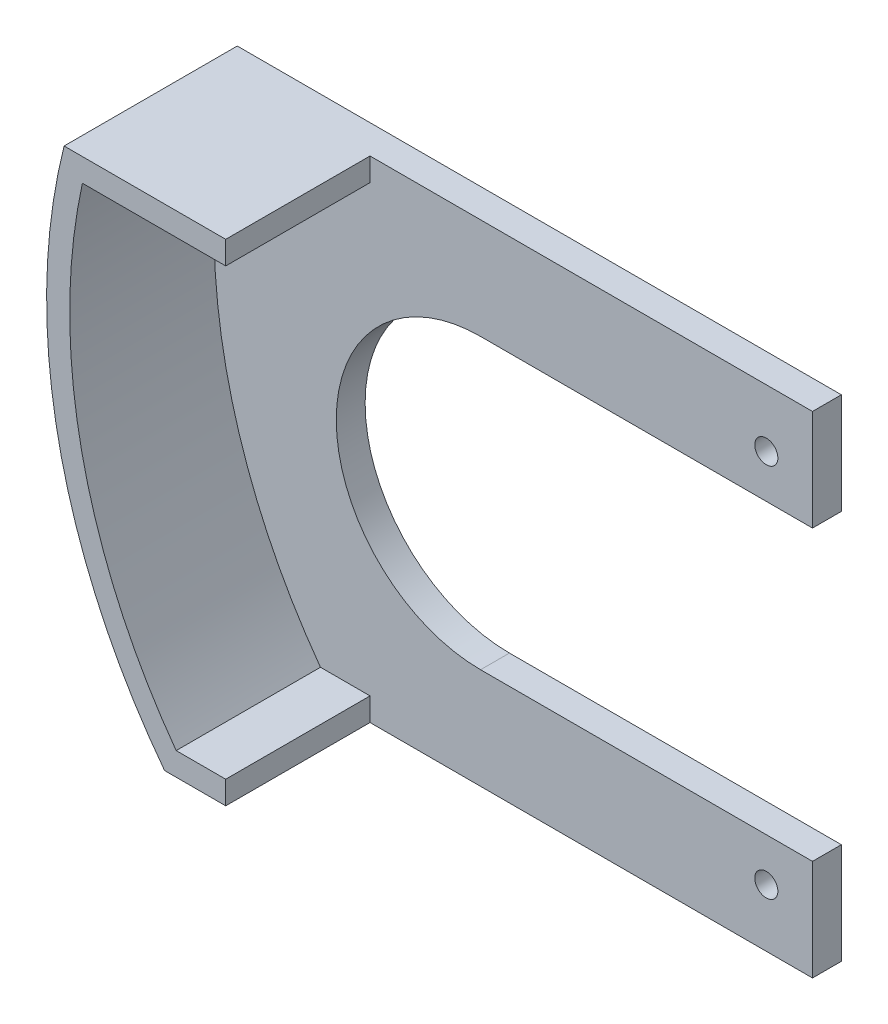
ISO-10303-21;
HEADER;
FILE_DESCRIPTION(('STEP AP214'),'2;1');
FILE_NAME('part.step','',(''),(''),'','','');
FILE_SCHEMA(('AUTOMOTIVE_DESIGN { 1 0 10303 214 1 1 1 1 }'));
ENDSEC;
DATA;
#1=APPLICATION_CONTEXT('core data for automotive mechanical design processes');
#2=APPLICATION_PROTOCOL_DEFINITION('international standard','automotive_design',2000,#1);
#3=PRODUCT_CONTEXT('',#1,'mechanical');
#4=PRODUCT('Part','Part','',(#3));
#5=PRODUCT_RELATED_PRODUCT_CATEGORY('part','',(#4));
#6=PRODUCT_DEFINITION_FORMATION('','',#4);
#7=PRODUCT_DEFINITION_CONTEXT('part definition',#1,'design');
#8=PRODUCT_DEFINITION('design','',#6,#7);
#9=PRODUCT_DEFINITION_SHAPE('','',#8);
#10=(LENGTH_UNIT() NAMED_UNIT(*) SI_UNIT(.MILLI.,.METRE.));
#11=(NAMED_UNIT(*) PLANE_ANGLE_UNIT() SI_UNIT($,.RADIAN.));
#12=(NAMED_UNIT(*) SI_UNIT($,.STERADIAN.) SOLID_ANGLE_UNIT());
#13=UNCERTAINTY_MEASURE_WITH_UNIT(LENGTH_MEASURE(1.E-05),#10,'distance_accuracy_value','');
#14=(GEOMETRIC_REPRESENTATION_CONTEXT(3) GLOBAL_UNCERTAINTY_ASSIGNED_CONTEXT((#13)) GLOBAL_UNIT_ASSIGNED_CONTEXT((#10,
#11,#12)) REPRESENTATION_CONTEXT('',''));
#15=CARTESIAN_POINT('',(0.,0.,0.));
#16=DIRECTION('',(0.,0.,1.));
#17=DIRECTION('',(1.,0.,0.));
#18=AXIS2_PLACEMENT_3D('',#15,#16,#17);
#19=CARTESIAN_POINT('',(0.,42.5,30.));
#20=DIRECTION('',(0.,1.,0.));
#21=DIRECTION('',(0.,0.,1.));
#22=AXIS2_PLACEMENT_3D('',#19,#20,#21);
#23=PLANE('',#22);
#24=DIRECTION('',(0.,0.,-1.));
#25=VECTOR('',#24,1.);
#26=CARTESIAN_POINT('',(41.6012087937572,42.5,30.));
#27=LINE('',#26,#25);
#28=CARTESIAN_POINT('',(41.6012087937572,42.5,30.));
#29=VERTEX_POINT('',#28);
#30=CARTESIAN_POINT('',(41.6012087937572,42.5,5.));
#31=VERTEX_POINT('',#30);
#32=EDGE_CURVE('E51',#29,#31,#27,.T.);
#33=ORIENTED_EDGE('',*,*,#32,.T.);
#34=DIRECTION('',(-1.,0.,0.));
#35=VECTOR('',#34,1.);
#36=CARTESIAN_POINT('',(0.,42.5,5.));
#37=LINE('',#36,#35);
#38=CARTESIAN_POINT('',(118.251926795963,42.5,5.));
#39=VERTEX_POINT('',#38);
#40=EDGE_CURVE('E242',#39,#31,#37,.T.);
#41=ORIENTED_EDGE('',*,*,#40,.F.);
#42=DIRECTION('',(0.,0.,-1.));
#43=VECTOR('',#42,1.);
#44=CARTESIAN_POINT('',(118.251926795963,42.5,5.));
#45=LINE('',#44,#43);
#46=CARTESIAN_POINT('',(118.251926795963,42.5,0.));
#47=VERTEX_POINT('',#46);
#48=EDGE_CURVE('E199',#39,#47,#45,.T.);
#49=ORIENTED_EDGE('',*,*,#48,.T.);
#50=DIRECTION('',(1.,0.,0.));
#51=VECTOR('',#50,1.);
#52=CARTESIAN_POINT('',(0.,42.5,0.));
#53=LINE('',#52,#51);
#54=CARTESIAN_POINT('',(13.6012087937572,42.5,0.));
#55=VERTEX_POINT('',#54);
#56=EDGE_CURVE('E126',#55,#47,#53,.T.);
#57=ORIENTED_EDGE('',*,*,#56,.F.);
#58=DIRECTION('',(0.,0.,-1.));
#59=VECTOR('',#58,1.);
#60=CARTESIAN_POINT('',(13.6012087937572,42.5,30.));
#61=LINE('',#60,#59);
#62=CARTESIAN_POINT('',(13.6012087937572,42.5,30.));
#63=VERTEX_POINT('',#62);
#64=EDGE_CURVE('E43',#63,#55,#61,.T.);
#65=ORIENTED_EDGE('',*,*,#64,.F.);
#66=DIRECTION('',(1.,0.,0.));
#67=VECTOR('',#66,1.);
#68=CARTESIAN_POINT('',(0.,42.5,30.));
#69=LINE('',#68,#67);
#70=EDGE_CURVE('E135',#63,#29,#69,.T.);
#71=ORIENTED_EDGE('',*,*,#70,.T.);
#72=EDGE_LOOP('',(#33,#41,#49,#57,#65,#71));
#73=FACE_BOUND('',#72,.T.);
#74=ADVANCED_FACE('F35',(#73),#23,.T.);
#75=CARTESIAN_POINT('',(110.573306047486,18.0784448854413,30.));
#76=DIRECTION('',(0.,0.,-1.));
#77=DIRECTION('',(-1.,0.,0.));
#78=AXIS2_PLACEMENT_3D('',#75,#76,#77);
#79=CYLINDRICAL_SURFACE('',#78,100.);
#80=ORIENTED_EDGE('',*,*,#64,.T.);
#81=CARTESIAN_POINT('',(110.573306047486,18.0784448854413,0.));
#82=DIRECTION('',(0.,0.,1.));
#83=DIRECTION('',(1.,0.,0.));
#84=AXIS2_PLACEMENT_3D('',#81,#82,#83);
#85=CIRCLE('',#84,100.);
#86=CARTESIAN_POINT('',(31.0104251590868,-42.5,0.));
#87=VERTEX_POINT('',#86);
#88=EDGE_CURVE('E129',#55,#87,#85,.T.);
#89=ORIENTED_EDGE('',*,*,#88,.T.);
#90=DIRECTION('',(0.,0.,-1.));
#91=VECTOR('',#90,1.);
#92=CARTESIAN_POINT('',(31.0104251590868,-42.5,30.));
#93=LINE('',#92,#91);
#94=CARTESIAN_POINT('',(31.0104251590868,-42.5,30.));
#95=VERTEX_POINT('',#94);
#96=EDGE_CURVE('E145',#95,#87,#93,.T.);
#97=ORIENTED_EDGE('',*,*,#96,.F.);
#98=CARTESIAN_POINT('',(110.573306047486,18.0784448854413,30.));
#99=DIRECTION('',(0.,0.,1.));
#100=DIRECTION('',(1.,0.,0.));
#101=AXIS2_PLACEMENT_3D('',#98,#99,#100);
#102=CIRCLE('',#101,100.);
#103=EDGE_CURVE('E221',#63,#95,#102,.T.);
#104=ORIENTED_EDGE('',*,*,#103,.F.);
#105=EDGE_LOOP('',(#80,#89,#97,#104));
#106=FACE_BOUND('',#105,.T.);
#107=ADVANCED_FACE('F156',(#106),#79,.T.);
#108=CARTESIAN_POINT('',(0.,-42.5000000000001,30.));
#109=DIRECTION('',(0.,1.,0.));
#110=DIRECTION('',(-1.,0.,0.));
#111=AXIS2_PLACEMENT_3D('',#108,#109,#110);
#112=PLANE('',#111);
#113=ORIENTED_EDGE('',*,*,#96,.T.);
#114=DIRECTION('',(1.,0.,0.));
#115=VECTOR('',#114,1.);
#116=CARTESIAN_POINT('',(0.,-42.5000000000001,0.));
#117=LINE('',#116,#115);
#118=CARTESIAN_POINT('',(118.251926795963,-42.5,0.));
#119=VERTEX_POINT('',#118);
#120=EDGE_CURVE('E132',#87,#119,#117,.T.);
#121=ORIENTED_EDGE('',*,*,#120,.T.);
#122=DIRECTION('',(0.,0.,-1.));
#123=VECTOR('',#122,1.);
#124=CARTESIAN_POINT('',(118.251926795963,-42.5,5.));
#125=LINE('',#124,#123);
#126=CARTESIAN_POINT('',(118.251926795963,-42.5,5.));
#127=VERTEX_POINT('',#126);
#128=EDGE_CURVE('E197',#127,#119,#125,.T.);
#129=ORIENTED_EDGE('',*,*,#128,.F.);
#130=DIRECTION('',(1.,0.,0.));
#131=VECTOR('',#130,1.);
#132=CARTESIAN_POINT('',(0.,-42.5,5.));
#133=LINE('',#132,#131);
#134=CARTESIAN_POINT('',(41.6012087937572,-42.5,5.));
#135=VERTEX_POINT('',#134);
#136=EDGE_CURVE('E237',#135,#127,#133,.T.);
#137=ORIENTED_EDGE('',*,*,#136,.F.);
#138=DIRECTION('',(0.,0.,-1.));
#139=VECTOR('',#138,1.);
#140=CARTESIAN_POINT('',(41.6012087937572,-42.5,30.));
#141=LINE('',#140,#139);
#142=CARTESIAN_POINT('',(41.6012087937572,-42.5,30.));
#143=VERTEX_POINT('',#142);
#144=EDGE_CURVE('E142',#143,#135,#141,.T.);
#145=ORIENTED_EDGE('',*,*,#144,.F.);
#146=DIRECTION('',(1.,0.,0.));
#147=VECTOR('',#146,1.);
#148=CARTESIAN_POINT('',(0.,-42.5000000000001,30.));
#149=LINE('',#148,#147);
#150=EDGE_CURVE('E155',#95,#143,#149,.T.);
#151=ORIENTED_EDGE('',*,*,#150,.F.);
#152=EDGE_LOOP('',(#113,#121,#129,#137,#145,#151));
#153=FACE_BOUND('',#152,.T.);
#154=ADVANCED_FACE('F149',(#153),#112,.F.);
#155=CARTESIAN_POINT('',(41.6012087937572,0.,30.));
#156=DIRECTION('',(-1.,0.,0.));
#157=DIRECTION('',(0.,0.,1.));
#158=AXIS2_PLACEMENT_3D('',#155,#156,#157);
#159=PLANE('',#158);
#160=ORIENTED_EDGE('',*,*,#144,.T.);
#161=DIRECTION('',(0.,1.,0.));
#162=VECTOR('',#161,1.);
#163=CARTESIAN_POINT('',(41.6012087937572,0.,5.));
#164=LINE('',#163,#162);
#165=CARTESIAN_POINT('',(41.6012087937572,-38.5,5.));
#166=VERTEX_POINT('',#165);
#167=EDGE_CURVE('E130',#135,#166,#164,.T.);
#168=ORIENTED_EDGE('',*,*,#167,.T.);
#169=DIRECTION('',(0.,0.,-1.));
#170=VECTOR('',#169,1.);
#171=CARTESIAN_POINT('',(41.6012087937572,-38.5,30.));
#172=LINE('',#171,#170);
#173=CARTESIAN_POINT('',(41.6012087937572,-38.5,30.));
#174=VERTEX_POINT('',#173);
#175=EDGE_CURVE('E139',#174,#166,#172,.T.);
#176=ORIENTED_EDGE('',*,*,#175,.F.);
#177=DIRECTION('',(0.,1.,0.));
#178=VECTOR('',#177,1.);
#179=CARTESIAN_POINT('',(41.6012087937572,0.,30.));
#180=LINE('',#179,#178);
#181=EDGE_CURVE('E224',#143,#174,#180,.T.);
#182=ORIENTED_EDGE('',*,*,#181,.F.);
#183=EDGE_LOOP('',(#160,#168,#176,#182));
#184=FACE_BOUND('',#183,.T.);
#185=ADVANCED_FACE('F230',(#184),#159,.F.);
#186=CARTESIAN_POINT('',(0.,-38.5,30.));
#187=DIRECTION('',(0.,1.,0.));
#188=DIRECTION('',(0.,0.,1.));
#189=AXIS2_PLACEMENT_3D('',#186,#187,#188);
#190=PLANE('',#189);
#191=DIRECTION('',(1.,0.,0.));
#192=VECTOR('',#191,1.);
#193=CARTESIAN_POINT('',(0.,-38.5,5.));
#194=LINE('',#193,#192);
#195=CARTESIAN_POINT('',(33.0176513578043,-38.5,5.));
#196=VERTEX_POINT('',#195);
#197=EDGE_CURVE('E74',#196,#166,#194,.T.);
#198=ORIENTED_EDGE('',*,*,#197,.F.);
#199=DIRECTION('',(0.,0.,-1.));
#200=VECTOR('',#199,1.);
#201=CARTESIAN_POINT('',(33.0176513578043,-38.5,30.));
#202=LINE('',#201,#200);
#203=CARTESIAN_POINT('',(33.0176513578043,-38.5,30.));
#204=VERTEX_POINT('',#203);
#205=EDGE_CURVE('E106',#204,#196,#202,.T.);
#206=ORIENTED_EDGE('',*,*,#205,.F.);
#207=DIRECTION('',(1.,0.,0.));
#208=VECTOR('',#207,1.);
#209=CARTESIAN_POINT('',(0.,-38.5,30.));
#210=LINE('',#209,#208);
#211=EDGE_CURVE('E117',#204,#174,#210,.T.);
#212=ORIENTED_EDGE('',*,*,#211,.T.);
#213=ORIENTED_EDGE('',*,*,#175,.T.);
#214=EDGE_LOOP('',(#198,#206,#212,#213));
#215=FACE_BOUND('',#214,.T.);
#216=ADVANCED_FACE('F226',(#215),#190,.T.);
#217=CARTESIAN_POINT('',(110.573306047486,18.0784448854413,30.));
#218=DIRECTION('',(0.,0.,-1.));
#219=DIRECTION('',(-1.,0.,0.));
#220=AXIS2_PLACEMENT_3D('',#217,#218,#219);
#221=CYLINDRICAL_SURFACE('',#220,96.);
#222=CARTESIAN_POINT('',(110.573306047486,18.0784448854413,5.));
#223=DIRECTION('',(0.,0.,1.));
#224=DIRECTION('',(1.,0.,0.));
#225=AXIS2_PLACEMENT_3D('',#222,#223,#224);
#226=CIRCLE('',#225,96.);
#227=CARTESIAN_POINT('',(16.7705337712728,38.5,5.));
#228=VERTEX_POINT('',#227);
#229=EDGE_CURVE('E102',#228,#196,#226,.T.);
#230=ORIENTED_EDGE('',*,*,#229,.F.);
#231=DIRECTION('',(0.,0.,-1.));
#232=VECTOR('',#231,1.);
#233=CARTESIAN_POINT('',(16.7705337712728,38.5,30.));
#234=LINE('',#233,#232);
#235=CARTESIAN_POINT('',(16.7705337712728,38.5,30.));
#236=VERTEX_POINT('',#235);
#237=EDGE_CURVE('E97',#236,#228,#234,.T.);
#238=ORIENTED_EDGE('',*,*,#237,.F.);
#239=CARTESIAN_POINT('',(110.573306047486,18.0784448854413,30.));
#240=DIRECTION('',(0.,0.,1.));
#241=DIRECTION('',(1.,0.,0.));
#242=AXIS2_PLACEMENT_3D('',#239,#240,#241);
#243=CIRCLE('',#242,96.);
#244=EDGE_CURVE('E101',#236,#204,#243,.T.);
#245=ORIENTED_EDGE('',*,*,#244,.T.);
#246=ORIENTED_EDGE('',*,*,#205,.T.);
#247=EDGE_LOOP('',(#230,#238,#245,#246));
#248=FACE_BOUND('',#247,.T.);
#249=ADVANCED_FACE('F99',(#248),#221,.F.);
#250=CARTESIAN_POINT('',(0.,38.5,30.));
#251=DIRECTION('',(0.,-1.,0.));
#252=DIRECTION('',(0.,0.,-1.));
#253=AXIS2_PLACEMENT_3D('',#250,#251,#252);
#254=PLANE('',#253);
#255=DIRECTION('',(-1.,0.,0.));
#256=VECTOR('',#255,1.);
#257=CARTESIAN_POINT('',(0.,38.5,5.));
#258=LINE('',#257,#256);
#259=CARTESIAN_POINT('',(41.6012087937572,38.5,5.));
#260=VERTEX_POINT('',#259);
#261=EDGE_CURVE('E214',#260,#228,#258,.T.);
#262=ORIENTED_EDGE('',*,*,#261,.F.);
#263=DIRECTION('',(0.,0.,-1.));
#264=VECTOR('',#263,1.);
#265=CARTESIAN_POINT('',(41.6012087937572,38.5,30.));
#266=LINE('',#265,#264);
#267=CARTESIAN_POINT('',(41.6012087937572,38.5,30.));
#268=VERTEX_POINT('',#267);
#269=EDGE_CURVE('E107',#268,#260,#266,.T.);
#270=ORIENTED_EDGE('',*,*,#269,.F.);
#271=DIRECTION('',(-1.,0.,0.));
#272=VECTOR('',#271,1.);
#273=CARTESIAN_POINT('',(0.,38.5,30.));
#274=LINE('',#273,#272);
#275=EDGE_CURVE('E115',#268,#236,#274,.T.);
#276=ORIENTED_EDGE('',*,*,#275,.T.);
#277=ORIENTED_EDGE('',*,*,#237,.T.);
#278=EDGE_LOOP('',(#262,#270,#276,#277));
#279=FACE_BOUND('',#278,.T.);
#280=ADVANCED_FACE('F119',(#279),#254,.T.);
#281=CARTESIAN_POINT('',(41.6012087937572,0.,30.));
#282=DIRECTION('',(1.,0.,0.));
#283=DIRECTION('',(0.,0.,-1.));
#284=AXIS2_PLACEMENT_3D('',#281,#282,#283);
#285=PLANE('',#284);
#286=DIRECTION('',(0.,-1.,0.));
#287=VECTOR('',#286,1.);
#288=CARTESIAN_POINT('',(41.6012087937572,0.,5.));
#289=LINE('',#288,#287);
#290=EDGE_CURVE('E11',#31,#260,#289,.T.);
#291=ORIENTED_EDGE('',*,*,#290,.F.);
#292=ORIENTED_EDGE('',*,*,#32,.F.);
#293=DIRECTION('',(0.,-1.,0.));
#294=VECTOR('',#293,1.);
#295=CARTESIAN_POINT('',(41.6012087937572,0.,30.));
#296=LINE('',#295,#294);
#297=EDGE_CURVE('E121',#29,#268,#296,.T.);
#298=ORIENTED_EDGE('',*,*,#297,.T.);
#299=ORIENTED_EDGE('',*,*,#269,.T.);
#300=EDGE_LOOP('',(#291,#292,#298,#299));
#301=FACE_BOUND('',#300,.T.);
#302=ADVANCED_FACE('F270',(#301),#285,.T.);
#303=CARTESIAN_POINT('',(0.,0.,30.));
#304=DIRECTION('',(0.,0.,1.));
#305=DIRECTION('',(1.,0.,0.));
#306=AXIS2_PLACEMENT_3D('',#303,#304,#305);
#307=PLANE('',#306);
#308=ORIENTED_EDGE('',*,*,#70,.F.);
#309=ORIENTED_EDGE('',*,*,#103,.T.);
#310=ORIENTED_EDGE('',*,*,#150,.T.);
#311=ORIENTED_EDGE('',*,*,#181,.T.);
#312=ORIENTED_EDGE('',*,*,#211,.F.);
#313=ORIENTED_EDGE('',*,*,#244,.F.);
#314=ORIENTED_EDGE('',*,*,#275,.F.);
#315=ORIENTED_EDGE('',*,*,#297,.F.);
#316=EDGE_LOOP('',(#308,#309,#310,#311,#312,#313,#314,#315));
#317=FACE_BOUND('',#316,.T.);
#318=ADVANCED_FACE('F113',(#317),#307,.T.);
#319=CARTESIAN_POINT('',(0.,0.,0.));
#320=DIRECTION('',(0.,0.,1.));
#321=DIRECTION('',(1.,0.,0.));
#322=AXIS2_PLACEMENT_3D('',#319,#320,#321);
#323=PLANE('',#322);
#324=DIRECTION('',(0.,1.,0.));
#325=VECTOR('',#324,1.);
#326=CARTESIAN_POINT('',(118.251926795963,0.,0.));
#327=LINE('',#326,#325);
#328=CARTESIAN_POINT('',(118.251926795963,-24.9999999999999,0.));
#329=VERTEX_POINT('',#328);
#330=EDGE_CURVE('E164',#119,#329,#327,.T.);
#331=ORIENTED_EDGE('',*,*,#330,.F.);
#332=ORIENTED_EDGE('',*,*,#120,.F.);
#333=ORIENTED_EDGE('',*,*,#88,.F.);
#334=ORIENTED_EDGE('',*,*,#56,.T.);
#335=DIRECTION('',(0.,-1.,0.));
#336=VECTOR('',#335,1.);
#337=CARTESIAN_POINT('',(118.251926795963,0.,0.));
#338=LINE('',#337,#336);
#339=CARTESIAN_POINT('',(118.251926795963,24.9999999999999,0.));
#340=VERTEX_POINT('',#339);
#341=EDGE_CURVE('E187',#47,#340,#338,.T.);
#342=ORIENTED_EDGE('',*,*,#341,.T.);
#343=DIRECTION('',(-1.,0.,0.));
#344=VECTOR('',#343,1.);
#345=CARTESIAN_POINT('',(0.,24.9999999999999,0.));
#346=LINE('',#345,#344);
#347=CARTESIAN_POINT('',(60.7519267959627,24.9999999999999,0.));
#348=VERTEX_POINT('',#347);
#349=EDGE_CURVE('E184',#340,#348,#346,.T.);
#350=ORIENTED_EDGE('',*,*,#349,.T.);
#351=CARTESIAN_POINT('',(60.7519267959627,1.31794753695004E-13,0.));
#352=DIRECTION('',(0.,0.,1.));
#353=DIRECTION('',(1.,0.,0.));
#354=AXIS2_PLACEMENT_3D('',#351,#352,#353);
#355=CIRCLE('',#354,25.);
#356=CARTESIAN_POINT('',(60.7519267959627,-24.9999999999999,0.));
#357=VERTEX_POINT('',#356);
#358=EDGE_CURVE('E177',#348,#357,#355,.T.);
#359=ORIENTED_EDGE('',*,*,#358,.T.);
#360=DIRECTION('',(-1.,0.,0.));
#361=VECTOR('',#360,1.);
#362=CARTESIAN_POINT('',(0.,-24.9999999999998,0.));
#363=LINE('',#362,#361);
#364=EDGE_CURVE('E168',#329,#357,#363,.T.);
#365=ORIENTED_EDGE('',*,*,#364,.F.);
#366=EDGE_LOOP('',(#331,#332,#333,#334,#342,#350,#359,#365));
#367=FACE_BOUND('',#366,.T.);
#368=CARTESIAN_POINT('',(110.251926795963,32.5,0.));
#369=DIRECTION('',(0.,0.,1.));
#370=DIRECTION('',(1.,0.,0.));
#371=AXIS2_PLACEMENT_3D('',#368,#369,#370);
#372=CIRCLE('',#371,2.);
#373=CARTESIAN_POINT('',(112.251926795963,32.5,0.));
#374=VERTEX_POINT('',#373);
#375=EDGE_CURVE('E175',#374,#374,#372,.F.);
#376=ORIENTED_EDGE('',*,*,#375,.F.);
#377=EDGE_LOOP('',(#376));
#378=FACE_BOUND('',#377,.T.);
#379=CARTESIAN_POINT('',(110.251926795963,-32.5,0.));
#380=DIRECTION('',(0.,0.,1.));
#381=DIRECTION('',(1.,0.,0.));
#382=AXIS2_PLACEMENT_3D('',#379,#380,#381);
#383=CIRCLE('',#382,2.);
#384=CARTESIAN_POINT('',(112.251926795963,-32.5,0.));
#385=VERTEX_POINT('',#384);
#386=EDGE_CURVE('E190',#385,#385,#383,.F.);
#387=ORIENTED_EDGE('',*,*,#386,.F.);
#388=EDGE_LOOP('',(#387));
#389=FACE_BOUND('',#388,.T.);
#390=CARTESIAN_POINT('',(20.2519267959627,32.5,0.));
#391=DIRECTION('',(0.,0.,1.));
#392=DIRECTION('',(1.,0.,0.));
#393=AXIS2_PLACEMENT_3D('',#390,#391,#392);
#394=CIRCLE('',#393,2.00000000000001);
#395=CARTESIAN_POINT('',(22.2519267959627,32.5,0.));
#396=VERTEX_POINT('',#395);
#397=EDGE_CURVE('E193',#396,#396,#394,.F.);
#398=ORIENTED_EDGE('',*,*,#397,.F.);
#399=EDGE_LOOP('',(#398));
#400=FACE_BOUND('',#399,.T.);
#401=ADVANCED_FACE('F160',(#367,#378,#389,#400),#323,.F.);
#402=CARTESIAN_POINT('',(0.,0.,5.));
#403=DIRECTION('',(0.,0.,1.));
#404=DIRECTION('',(1.,0.,0.));
#405=AXIS2_PLACEMENT_3D('',#402,#403,#404);
#406=PLANE('',#405);
#407=CARTESIAN_POINT('',(20.2519267959627,32.5,5.));
#408=DIRECTION('',(0.,0.,1.));
#409=DIRECTION('',(1.,0.,0.));
#410=AXIS2_PLACEMENT_3D('',#407,#408,#409);
#411=CIRCLE('',#410,2.00000000000001);
#412=CARTESIAN_POINT('',(22.2519267959627,32.5,5.));
#413=VERTEX_POINT('',#412);
#414=EDGE_CURVE('E200',#413,#413,#411,.F.);
#415=ORIENTED_EDGE('',*,*,#414,.T.);
#416=EDGE_LOOP('',(#415));
#417=FACE_BOUND('',#416,.T.);
#418=CARTESIAN_POINT('',(110.251926795963,-32.5,5.));
#419=DIRECTION('',(0.,0.,1.));
#420=DIRECTION('',(1.,0.,0.));
#421=AXIS2_PLACEMENT_3D('',#418,#419,#420);
#422=CIRCLE('',#421,2.);
#423=CARTESIAN_POINT('',(112.251926795963,-32.5,5.));
#424=VERTEX_POINT('',#423);
#425=EDGE_CURVE('E241',#424,#424,#422,.F.);
#426=ORIENTED_EDGE('',*,*,#425,.T.);
#427=EDGE_LOOP('',(#426));
#428=FACE_BOUND('',#427,.T.);
#429=CARTESIAN_POINT('',(110.251926795963,32.5,5.));
#430=DIRECTION('',(0.,0.,1.));
#431=DIRECTION('',(1.,0.,0.));
#432=AXIS2_PLACEMENT_3D('',#429,#430,#431);
#433=CIRCLE('',#432,2.);
#434=CARTESIAN_POINT('',(112.251926795963,32.5,5.));
#435=VERTEX_POINT('',#434);
#436=EDGE_CURVE('E196',#435,#435,#433,.F.);
#437=ORIENTED_EDGE('',*,*,#436,.T.);
#438=EDGE_LOOP('',(#437));
#439=FACE_BOUND('',#438,.T.);
#440=ORIENTED_EDGE('',*,*,#167,.F.);
#441=ORIENTED_EDGE('',*,*,#136,.T.);
#442=DIRECTION('',(0.,1.,0.));
#443=VECTOR('',#442,1.);
#444=CARTESIAN_POINT('',(118.251926795963,0.,5.));
#445=LINE('',#444,#443);
#446=CARTESIAN_POINT('',(118.251926795963,-24.9999999999999,5.));
#447=VERTEX_POINT('',#446);
#448=EDGE_CURVE('E425',#127,#447,#445,.T.);
#449=ORIENTED_EDGE('',*,*,#448,.T.);
#450=DIRECTION('',(-1.,0.,0.));
#451=VECTOR('',#450,1.);
#452=CARTESIAN_POINT('',(0.,-24.9999999999998,5.));
#453=LINE('',#452,#451);
#454=CARTESIAN_POINT('',(60.7519267959627,-24.9999999999999,5.));
#455=VERTEX_POINT('',#454);
#456=EDGE_CURVE('E427',#447,#455,#453,.T.);
#457=ORIENTED_EDGE('',*,*,#456,.T.);
#458=CARTESIAN_POINT('',(60.7519267959627,1.31794753695004E-13,5.));
#459=DIRECTION('',(0.,0.,1.));
#460=DIRECTION('',(1.,0.,0.));
#461=AXIS2_PLACEMENT_3D('',#458,#459,#460);
#462=CIRCLE('',#461,25.);
#463=CARTESIAN_POINT('',(60.7519267959627,24.9999999999999,5.));
#464=VERTEX_POINT('',#463);
#465=EDGE_CURVE('E432',#464,#455,#462,.T.);
#466=ORIENTED_EDGE('',*,*,#465,.F.);
#467=DIRECTION('',(-1.,0.,0.));
#468=VECTOR('',#467,1.);
#469=CARTESIAN_POINT('',(0.,24.9999999999999,5.));
#470=LINE('',#469,#468);
#471=CARTESIAN_POINT('',(118.251926795963,24.9999999999999,5.));
#472=VERTEX_POINT('',#471);
#473=EDGE_CURVE('E435',#472,#464,#470,.T.);
#474=ORIENTED_EDGE('',*,*,#473,.F.);
#475=DIRECTION('',(0.,-1.,0.));
#476=VECTOR('',#475,1.);
#477=CARTESIAN_POINT('',(118.251926795963,0.,5.));
#478=LINE('',#477,#476);
#479=EDGE_CURVE('E247',#39,#472,#478,.T.);
#480=ORIENTED_EDGE('',*,*,#479,.F.);
#481=ORIENTED_EDGE('',*,*,#40,.T.);
#482=ORIENTED_EDGE('',*,*,#290,.T.);
#483=ORIENTED_EDGE('',*,*,#261,.T.);
#484=ORIENTED_EDGE('',*,*,#229,.T.);
#485=ORIENTED_EDGE('',*,*,#197,.T.);
#486=EDGE_LOOP('',(#440,#441,#449,#457,#466,#474,#480,#481,#482,#483,#484,#485));
#487=FACE_BOUND('',#486,.T.);
#488=ADVANCED_FACE('F234',(#417,#428,#439,#487),#406,.T.);
#489=CARTESIAN_POINT('',(118.251926795963,0.,5.));
#490=DIRECTION('',(-1.,0.,0.));
#491=DIRECTION('',(0.,0.,1.));
#492=AXIS2_PLACEMENT_3D('',#489,#490,#491);
#493=PLANE('',#492);
#494=ORIENTED_EDGE('',*,*,#330,.T.);
#495=DIRECTION('',(0.,0.,-1.));
#496=VECTOR('',#495,1.);
#497=CARTESIAN_POINT('',(118.251926795963,-24.9999999999999,5.));
#498=LINE('',#497,#496);
#499=EDGE_CURVE('E212',#447,#329,#498,.T.);
#500=ORIENTED_EDGE('',*,*,#499,.F.);
#501=ORIENTED_EDGE('',*,*,#448,.F.);
#502=ORIENTED_EDGE('',*,*,#128,.T.);
#503=EDGE_LOOP('',(#494,#500,#501,#502));
#504=FACE_BOUND('',#503,.T.);
#505=ADVANCED_FACE('F268',(#504),#493,.F.);
#506=CARTESIAN_POINT('',(0.,-24.9999999999998,5.));
#507=DIRECTION('',(0.,-1.,0.));
#508=DIRECTION('',(1.,0.,0.));
#509=AXIS2_PLACEMENT_3D('',#506,#507,#508);
#510=PLANE('',#509);
#511=ORIENTED_EDGE('',*,*,#364,.T.);
#512=DIRECTION('',(0.,0.,-1.));
#513=VECTOR('',#512,1.);
#514=CARTESIAN_POINT('',(60.7519267959627,-24.9999999999999,5.));
#515=LINE('',#514,#513);
#516=EDGE_CURVE('E209',#455,#357,#515,.T.);
#517=ORIENTED_EDGE('',*,*,#516,.F.);
#518=ORIENTED_EDGE('',*,*,#456,.F.);
#519=ORIENTED_EDGE('',*,*,#499,.T.);
#520=EDGE_LOOP('',(#511,#517,#518,#519));
#521=FACE_BOUND('',#520,.T.);
#522=ADVANCED_FACE('F342',(#521),#510,.F.);
#523=CARTESIAN_POINT('',(60.7519267959627,1.31794753695004E-13,5.));
#524=DIRECTION('',(0.,0.,-1.));
#525=DIRECTION('',(-1.,0.,0.));
#526=AXIS2_PLACEMENT_3D('',#523,#524,#525);
#527=CYLINDRICAL_SURFACE('',#526,25.);
#528=ORIENTED_EDGE('',*,*,#358,.F.);
#529=DIRECTION('',(0.,0.,-1.));
#530=VECTOR('',#529,1.);
#531=CARTESIAN_POINT('',(60.7519267959627,24.9999999999999,5.));
#532=LINE('',#531,#530);
#533=EDGE_CURVE('E206',#464,#348,#532,.T.);
#534=ORIENTED_EDGE('',*,*,#533,.F.);
#535=ORIENTED_EDGE('',*,*,#465,.T.);
#536=ORIENTED_EDGE('',*,*,#516,.T.);
#537=EDGE_LOOP('',(#528,#534,#535,#536));
#538=FACE_BOUND('',#537,.T.);
#539=ADVANCED_FACE('F351',(#538),#527,.F.);
#540=CARTESIAN_POINT('',(0.,24.9999999999999,5.));
#541=DIRECTION('',(0.,-1.,0.));
#542=DIRECTION('',(1.,0.,0.));
#543=AXIS2_PLACEMENT_3D('',#540,#541,#542);
#544=PLANE('',#543);
#545=ORIENTED_EDGE('',*,*,#349,.F.);
#546=DIRECTION('',(0.,0.,-1.));
#547=VECTOR('',#546,1.);
#548=CARTESIAN_POINT('',(118.251926795963,24.9999999999999,5.));
#549=LINE('',#548,#547);
#550=EDGE_CURVE('E203',#472,#340,#549,.T.);
#551=ORIENTED_EDGE('',*,*,#550,.F.);
#552=ORIENTED_EDGE('',*,*,#473,.T.);
#553=ORIENTED_EDGE('',*,*,#533,.T.);
#554=EDGE_LOOP('',(#545,#551,#552,#553));
#555=FACE_BOUND('',#554,.T.);
#556=ADVANCED_FACE('F361',(#555),#544,.T.);
#557=CARTESIAN_POINT('',(118.251926795963,0.,5.));
#558=DIRECTION('',(1.,0.,0.));
#559=DIRECTION('',(0.,0.,-1.));
#560=AXIS2_PLACEMENT_3D('',#557,#558,#559);
#561=PLANE('',#560);
#562=ORIENTED_EDGE('',*,*,#341,.F.);
#563=ORIENTED_EDGE('',*,*,#48,.F.);
#564=ORIENTED_EDGE('',*,*,#479,.T.);
#565=ORIENTED_EDGE('',*,*,#550,.T.);
#566=EDGE_LOOP('',(#562,#563,#564,#565));
#567=FACE_BOUND('',#566,.T.);
#568=ADVANCED_FACE('F371',(#567),#561,.T.);
#569=CARTESIAN_POINT('',(110.251926795963,-32.5,5.));
#570=DIRECTION('',(0.,0.,-1.));
#571=DIRECTION('',(-1.,0.,0.));
#572=AXIS2_PLACEMENT_3D('',#569,#570,#571);
#573=CYLINDRICAL_SURFACE('',#572,2.);
#574=ORIENTED_EDGE('',*,*,#425,.F.);
#575=EDGE_LOOP('',(#574));
#576=FACE_BOUND('',#575,.T.);
#577=ORIENTED_EDGE('',*,*,#386,.T.);
#578=EDGE_LOOP('',(#577));
#579=FACE_BOUND('',#578,.T.);
#580=ADVANCED_FACE('F381',(#576,#579),#573,.F.);
#581=CARTESIAN_POINT('',(110.251926795963,32.5,5.));
#582=DIRECTION('',(0.,0.,-1.));
#583=DIRECTION('',(-1.,0.,0.));
#584=AXIS2_PLACEMENT_3D('',#581,#582,#583);
#585=CYLINDRICAL_SURFACE('',#584,2.);
#586=ORIENTED_EDGE('',*,*,#436,.F.);
#587=EDGE_LOOP('',(#586));
#588=FACE_BOUND('',#587,.T.);
#589=ORIENTED_EDGE('',*,*,#375,.T.);
#590=EDGE_LOOP('',(#589));
#591=FACE_BOUND('',#590,.T.);
#592=ADVANCED_FACE('F258',(#588,#591),#585,.F.);
#593=CARTESIAN_POINT('',(20.2519267959627,32.5,5.));
#594=DIRECTION('',(0.,0.,-1.));
#595=DIRECTION('',(-1.,0.,0.));
#596=AXIS2_PLACEMENT_3D('',#593,#594,#595);
#597=CYLINDRICAL_SURFACE('',#596,2.00000000000001);
#598=ORIENTED_EDGE('',*,*,#414,.F.);
#599=EDGE_LOOP('',(#598));
#600=FACE_BOUND('',#599,.T.);
#601=ORIENTED_EDGE('',*,*,#397,.T.);
#602=EDGE_LOOP('',(#601));
#603=FACE_BOUND('',#602,.T.);
#604=ADVANCED_FACE('F255',(#600,#603),#597,.F.);
#605=CLOSED_SHELL('',(#74,#107,#154,#185,#216,#249,#280,#302,#318,#401,#488,#505,#522,#539,#556,
#568,#580,#592,#604));
#606=MANIFOLD_SOLID_BREP('B2',#605);
#607=ADVANCED_BREP_SHAPE_REPRESENTATION('',(#18,#606),#14);
#608=SHAPE_DEFINITION_REPRESENTATION(#9,#607);
ENDSEC;
END-ISO-10303-21;
